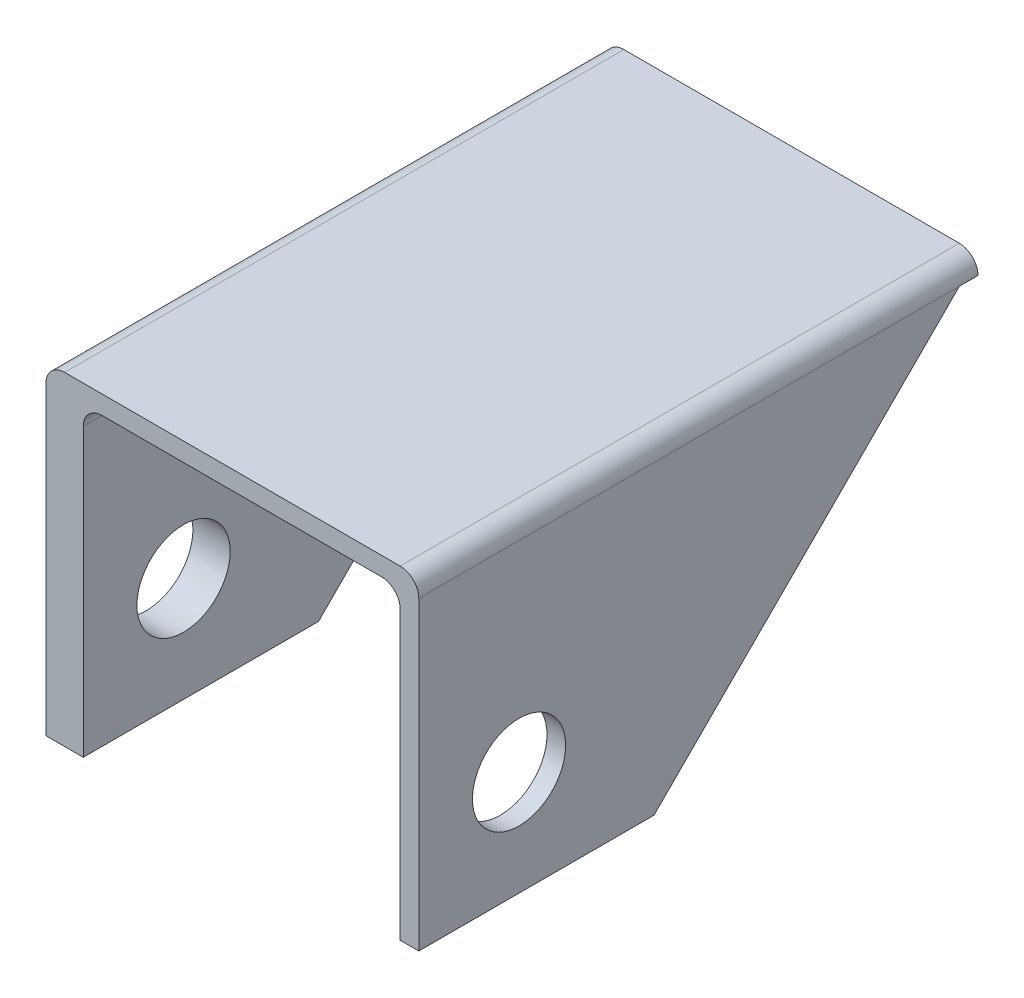
ISO-10303-21;
HEADER;
FILE_DESCRIPTION(('STEP AP214'),'2;1');
FILE_NAME('part.step','',(''),(''),'','','');
FILE_SCHEMA(('AUTOMOTIVE_DESIGN { 1 0 10303 214 1 1 1 1 }'));
ENDSEC;
DATA;
#1=APPLICATION_CONTEXT('core data for automotive mechanical design processes');
#2=APPLICATION_PROTOCOL_DEFINITION('international standard','automotive_design',2000,#1);
#3=PRODUCT_CONTEXT('',#1,'mechanical');
#4=PRODUCT('Part','Part','',(#3));
#5=PRODUCT_RELATED_PRODUCT_CATEGORY('part','',(#4));
#6=PRODUCT_DEFINITION_FORMATION('','',#4);
#7=PRODUCT_DEFINITION_CONTEXT('part definition',#1,'design');
#8=PRODUCT_DEFINITION('design','',#6,#7);
#9=PRODUCT_DEFINITION_SHAPE('','',#8);
#10=(LENGTH_UNIT() NAMED_UNIT(*) SI_UNIT(.MILLI.,.METRE.));
#11=(NAMED_UNIT(*) PLANE_ANGLE_UNIT() SI_UNIT($,.RADIAN.));
#12=(NAMED_UNIT(*) SI_UNIT($,.STERADIAN.) SOLID_ANGLE_UNIT());
#13=UNCERTAINTY_MEASURE_WITH_UNIT(LENGTH_MEASURE(1.E-05),#10,'distance_accuracy_value','');
#14=(GEOMETRIC_REPRESENTATION_CONTEXT(3) GLOBAL_UNCERTAINTY_ASSIGNED_CONTEXT((#13)) GLOBAL_UNIT_ASSIGNED_CONTEXT((#10,
#11,#12)) REPRESENTATION_CONTEXT('',''));
#15=CARTESIAN_POINT('',(0.,0.,0.));
#16=DIRECTION('',(0.,0.,1.));
#17=DIRECTION('',(1.,0.,0.));
#18=AXIS2_PLACEMENT_3D('',#15,#16,#17);
#19=CARTESIAN_POINT('',(1.,24.3409758965315,-30.));
#20=DIRECTION('',(0.,0.707106781186547,0.707106781186547));
#21=DIRECTION('',(0.,-0.707106781186548,0.707106781186548));
#22=AXIS2_PLACEMENT_3D('',#19,#20,#21);
#23=PLANE('',#22);
#24=DIRECTION('',(0.,0.707106781186547,-0.707106781186547));
#25=VECTOR('',#24,1.);
#26=CARTESIAN_POINT('',(2.,24.3409758965315,-30.));
#27=LINE('',#26,#25);
#28=CARTESIAN_POINT('',(2.,6.9567267449838,-12.6157508484523));
#29=VERTEX_POINT('',#28);
#30=CARTESIAN_POINT('',(2.,22.3409758965315,-28.));
#31=VERTEX_POINT('',#30);
#32=EDGE_CURVE('E218',#29,#31,#27,.T.);
#33=ORIENTED_EDGE('',*,*,#32,.F.);
#34=DIRECTION('',(-1.,0.,0.));
#35=VECTOR('',#34,1.);
#36=CARTESIAN_POINT('',(1.,6.9567267449838,-12.6157508484523));
#37=LINE('',#36,#35);
#38=CARTESIAN_POINT('',(0.,6.9567267449838,-12.6157508484523));
#39=VERTEX_POINT('',#38);
#40=EDGE_CURVE('E55',#29,#39,#37,.T.);
#41=ORIENTED_EDGE('',*,*,#40,.T.);
#42=DIRECTION('',(0.,0.707106781186547,-0.707106781186547));
#43=VECTOR('',#42,1.);
#44=CARTESIAN_POINT('',(0.,24.3409758965315,-30.));
#45=LINE('',#44,#43);
#46=CARTESIAN_POINT('',(0.,23.3409758965315,-29.));
#47=VERTEX_POINT('',#46);
#48=EDGE_CURVE('E144',#39,#47,#45,.T.);
#49=ORIENTED_EDGE('',*,*,#48,.T.);
#50=DIRECTION('',(-1.,0.,0.));
#51=VECTOR('',#50,1.);
#52=CARTESIAN_POINT('',(1.,23.3409758965315,-29.));
#53=LINE('',#52,#51);
#54=CARTESIAN_POINT('',(3.,23.3409758965315,-29.));
#55=VERTEX_POINT('',#54);
#56=EDGE_CURVE('E149',#55,#47,#53,.T.);
#57=ORIENTED_EDGE('',*,*,#56,.F.);
#58=CARTESIAN_POINT('',(3.,22.3409758965315,-28.));
#59=DIRECTION('',(0.,0.707106781186547,0.707106781186547));
#60=DIRECTION('',(0.,0.707106781186548,-0.707106781186548));
#61=AXIS2_PLACEMENT_3D('',#58,#59,#60);
#62=ELLIPSE('',#61,1.4142135623731,1.);
#63=EDGE_CURVE('E190',#55,#31,#62,.T.);
#64=ORIENTED_EDGE('',*,*,#63,.T.);
#65=EDGE_LOOP('',(#33,#41,#49,#57,#64));
#66=FACE_BOUND('',#65,.T.);
#67=ADVANCED_FACE('F33',(#66),#23,.F.);
#68=CARTESIAN_POINT('',(1.,-5.65902410346854,0.));
#69=DIRECTION('',(0.,0.,-1.));
#70=DIRECTION('',(-1.,0.,0.));
#71=AXIS2_PLACEMENT_3D('',#68,#69,#70);
#72=PLANE('',#71);
#73=DIRECTION('',(0.,-1.,0.));
#74=VECTOR('',#73,1.);
#75=CARTESIAN_POINT('',(0.,-5.65902410346854,0.));
#76=LINE('',#75,#74);
#77=CARTESIAN_POINT('',(0.,23.3409758965315,0.));
#78=VERTEX_POINT('',#77);
#79=CARTESIAN_POINT('',(0.,6.9567267449838,0.));
#80=VERTEX_POINT('',#79);
#81=EDGE_CURVE('E142',#78,#80,#76,.T.);
#82=ORIENTED_EDGE('',*,*,#81,.T.);
#83=DIRECTION('',(1.,0.,0.));
#84=VECTOR('',#83,1.);
#85=CARTESIAN_POINT('',(1.,6.9567267449838,0.));
#86=LINE('',#85,#84);
#87=CARTESIAN_POINT('',(2.,6.9567267449838,0.));
#88=VERTEX_POINT('',#87);
#89=EDGE_CURVE('E125',#80,#88,#86,.T.);
#90=ORIENTED_EDGE('',*,*,#89,.T.);
#91=DIRECTION('',(0.,-1.,0.));
#92=VECTOR('',#91,1.);
#93=CARTESIAN_POINT('',(2.,-5.65902410346854,0.));
#94=LINE('',#93,#92);
#95=CARTESIAN_POINT('',(2.,22.3409758965315,0.));
#96=VERTEX_POINT('',#95);
#97=EDGE_CURVE('E205',#96,#88,#94,.T.);
#98=ORIENTED_EDGE('',*,*,#97,.F.);
#99=CARTESIAN_POINT('',(3.,22.3409758965315,0.));
#100=DIRECTION('',(0.,0.,-1.));
#101=DIRECTION('',(-1.,0.,0.));
#102=AXIS2_PLACEMENT_3D('',#99,#100,#101);
#103=CIRCLE('',#102,1.);
#104=CARTESIAN_POINT('',(3.,23.3409758965315,0.));
#105=VERTEX_POINT('',#104);
#106=EDGE_CURVE('E193',#96,#105,#103,.T.);
#107=ORIENTED_EDGE('',*,*,#106,.T.);
#108=DIRECTION('',(1.,0.,0.));
#109=VECTOR('',#108,1.);
#110=CARTESIAN_POINT('',(0.,23.3409758965315,0.));
#111=LINE('',#110,#109);
#112=CARTESIAN_POINT('',(18.,23.3409758965315,0.));
#113=VERTEX_POINT('',#112);
#114=EDGE_CURVE('E232',#105,#113,#111,.T.);
#115=ORIENTED_EDGE('',*,*,#114,.T.);
#116=CARTESIAN_POINT('',(18.,22.3409758965315,0.));
#117=DIRECTION('',(0.,0.,-1.));
#118=DIRECTION('',(-1.,0.,0.));
#119=AXIS2_PLACEMENT_3D('',#116,#117,#118);
#120=CIRCLE('',#119,1.);
#121=CARTESIAN_POINT('',(19.,22.3409758965315,0.));
#122=VERTEX_POINT('',#121);
#123=EDGE_CURVE('E41',#113,#122,#120,.T.);
#124=ORIENTED_EDGE('',*,*,#123,.T.);
#125=DIRECTION('',(0.,-1.,0.));
#126=VECTOR('',#125,1.);
#127=CARTESIAN_POINT('',(19.,-5.65902410346854,0.));
#128=LINE('',#127,#126);
#129=CARTESIAN_POINT('',(19.,6.9567267449838,0.));
#130=VERTEX_POINT('',#129);
#131=EDGE_CURVE('E221',#122,#130,#128,.T.);
#132=ORIENTED_EDGE('',*,*,#131,.T.);
#133=CARTESIAN_POINT('',(20.,6.9567267449838,0.));
#134=VERTEX_POINT('',#133);
#135=EDGE_CURVE('E135',#130,#134,#86,.T.);
#136=ORIENTED_EDGE('',*,*,#135,.T.);
#137=DIRECTION('',(0.,1.,0.));
#138=VECTOR('',#137,1.);
#139=CARTESIAN_POINT('',(20.,23.3409758965315,0.));
#140=LINE('',#139,#138);
#141=CARTESIAN_POINT('',(20.,23.3409758965315,0.));
#142=VERTEX_POINT('',#141);
#143=EDGE_CURVE('E154',#134,#142,#140,.T.);
#144=ORIENTED_EDGE('',*,*,#143,.T.);
#145=CARTESIAN_POINT('',(19.,23.3409758965315,0.));
#146=DIRECTION('',(0.,0.,-1.));
#147=DIRECTION('',(-1.,0.,0.));
#148=AXIS2_PLACEMENT_3D('',#145,#146,#147);
#149=CIRCLE('',#148,1.);
#150=CARTESIAN_POINT('',(19.,24.3409758965315,0.));
#151=VERTEX_POINT('',#150);
#152=EDGE_CURVE('E175',#142,#151,#149,.F.);
#153=ORIENTED_EDGE('',*,*,#152,.T.);
#154=DIRECTION('',(-1.,0.,0.));
#155=VECTOR('',#154,1.);
#156=CARTESIAN_POINT('',(1.,24.3409758965315,0.));
#157=LINE('',#156,#155);
#158=CARTESIAN_POINT('',(1.,24.3409758965315,0.));
#159=VERTEX_POINT('',#158);
#160=EDGE_CURVE('E151',#151,#159,#157,.T.);
#161=ORIENTED_EDGE('',*,*,#160,.T.);
#162=CARTESIAN_POINT('',(1.,23.3409758965315,0.));
#163=DIRECTION('',(0.,0.,-1.));
#164=DIRECTION('',(-1.,0.,0.));
#165=AXIS2_PLACEMENT_3D('',#162,#163,#164);
#166=CIRCLE('',#165,1.);
#167=EDGE_CURVE('E148',#159,#78,#166,.F.);
#168=ORIENTED_EDGE('',*,*,#167,.T.);
#169=EDGE_LOOP('',(#82,#90,#98,#107,#115,#124,#132,#136,#144,#153,#161,#168));
#170=FACE_BOUND('',#169,.T.);
#171=ADVANCED_FACE('F146',(#170),#72,.F.);
#172=CARTESIAN_POINT('',(1.,24.3409758965315,0.));
#173=DIRECTION('',(0.,-1.,0.));
#174=DIRECTION('',(0.,0.,-1.));
#175=AXIS2_PLACEMENT_3D('',#172,#173,#174);
#176=PLANE('',#175);
#177=DIRECTION('',(-1.,0.,0.));
#178=VECTOR('',#177,1.);
#179=CARTESIAN_POINT('',(1.,24.3409758965315,-30.));
#180=LINE('',#179,#178);
#181=CARTESIAN_POINT('',(19.,24.3409758965315,-30.));
#182=VERTEX_POINT('',#181);
#183=CARTESIAN_POINT('',(1.,24.3409758965315,-30.));
#184=VERTEX_POINT('',#183);
#185=EDGE_CURVE('E159',#182,#184,#180,.T.);
#186=ORIENTED_EDGE('',*,*,#185,.T.);
#187=DIRECTION('',(0.,0.,1.));
#188=VECTOR('',#187,1.);
#189=CARTESIAN_POINT('',(1.,24.3409758965315,0.));
#190=LINE('',#189,#188);
#191=EDGE_CURVE('E172',#184,#159,#190,.T.);
#192=ORIENTED_EDGE('',*,*,#191,.T.);
#193=ORIENTED_EDGE('',*,*,#160,.F.);
#194=DIRECTION('',(0.,0.,-1.));
#195=VECTOR('',#194,1.);
#196=CARTESIAN_POINT('',(19.,24.3409758965315,-30.));
#197=LINE('',#196,#195);
#198=EDGE_CURVE('E169',#151,#182,#197,.T.);
#199=ORIENTED_EDGE('',*,*,#198,.T.);
#200=EDGE_LOOP('',(#186,#192,#193,#199));
#201=FACE_BOUND('',#200,.T.);
#202=ADVANCED_FACE('F254',(#201),#176,.F.);
#203=CARTESIAN_POINT('',(0.,0.,0.));
#204=DIRECTION('',(-1.,0.,0.));
#205=DIRECTION('',(0.,0.,1.));
#206=AXIS2_PLACEMENT_3D('',#203,#204,#205);
#207=PLANE('',#206);
#208=DIRECTION('',(0.,0.,-1.));
#209=VECTOR('',#208,1.);
#210=CARTESIAN_POINT('',(0.,6.9567267449838,6.4128425443619));
#211=LINE('',#210,#209);
#212=EDGE_CURVE('E128',#80,#39,#211,.T.);
#213=ORIENTED_EDGE('',*,*,#212,.F.);
#214=ORIENTED_EDGE('',*,*,#81,.F.);
#215=DIRECTION('',(0.,0.,1.));
#216=VECTOR('',#215,1.);
#217=CARTESIAN_POINT('',(0.,23.3409758965315,-30.));
#218=LINE('',#217,#216);
#219=EDGE_CURVE('E178',#78,#47,#218,.F.);
#220=ORIENTED_EDGE('',*,*,#219,.T.);
#221=ORIENTED_EDGE('',*,*,#48,.F.);
#222=EDGE_LOOP('',(#213,#214,#220,#221));
#223=FACE_BOUND('',#222,.T.);
#224=CARTESIAN_POINT('',(0.,12.5788203423205,-5.37794980513693));
#225=DIRECTION('',(-1.,0.,0.));
#226=DIRECTION('',(0.,0.,1.));
#227=AXIS2_PLACEMENT_3D('',#224,#225,#226);
#228=CIRCLE('',#227,2.5);
#229=CARTESIAN_POINT('',(0.,12.5788203423205,-2.87794980513692));
#230=VERTEX_POINT('',#229);
#231=EDGE_CURVE('E208',#230,#230,#228,.T.);
#232=ORIENTED_EDGE('',*,*,#231,.F.);
#233=EDGE_LOOP('',(#232));
#234=FACE_BOUND('',#233,.T.);
#235=ADVANCED_FACE('F139',(#223,#234),#207,.T.);
#236=CARTESIAN_POINT('',(0.,23.3409758965315,0.));
#237=DIRECTION('',(0.,1.,0.));
#238=DIRECTION('',(0.,0.,1.));
#239=AXIS2_PLACEMENT_3D('',#236,#237,#238);
#240=PLANE('',#239);
#241=ORIENTED_EDGE('',*,*,#114,.F.);
#242=DIRECTION('',(0.,0.,-1.));
#243=VECTOR('',#242,1.);
#244=CARTESIAN_POINT('',(3.,23.3409758965315,0.));
#245=LINE('',#244,#243);
#246=EDGE_CURVE('E164',#105,#55,#245,.T.);
#247=ORIENTED_EDGE('',*,*,#246,.T.);
#248=ORIENTED_EDGE('',*,*,#56,.T.);
#249=DIRECTION('',(0.,0.,1.));
#250=VECTOR('',#249,1.);
#251=CARTESIAN_POINT('',(0.,23.3409758965315,-30.));
#252=LINE('',#251,#250);
#253=CARTESIAN_POINT('',(0.,23.3409758965315,-30.));
#254=VERTEX_POINT('',#253);
#255=EDGE_CURVE('E229',#254,#47,#252,.T.);
#256=ORIENTED_EDGE('',*,*,#255,.F.);
#257=DIRECTION('',(-1.,0.,0.));
#258=VECTOR('',#257,1.);
#259=CARTESIAN_POINT('',(0.,23.3409758965315,-30.));
#260=LINE('',#259,#258);
#261=CARTESIAN_POINT('',(20.,23.3409758965315,-30.));
#262=VERTEX_POINT('',#261);
#263=EDGE_CURVE('E238',#262,#254,#260,.T.);
#264=ORIENTED_EDGE('',*,*,#263,.F.);
#265=DIRECTION('',(0.,0.,-1.));
#266=VECTOR('',#265,1.);
#267=CARTESIAN_POINT('',(20.,23.3409758965315,-30.));
#268=LINE('',#267,#266);
#269=CARTESIAN_POINT('',(20.,23.3409758965315,-29.));
#270=VERTEX_POINT('',#269);
#271=EDGE_CURVE('E235',#270,#262,#268,.T.);
#272=ORIENTED_EDGE('',*,*,#271,.F.);
#273=DIRECTION('',(-1.,0.,0.));
#274=VECTOR('',#273,1.);
#275=CARTESIAN_POINT('',(0.,23.3409758965315,-29.));
#276=LINE('',#275,#274);
#277=CARTESIAN_POINT('',(18.,23.3409758965315,-29.));
#278=VERTEX_POINT('',#277);
#279=EDGE_CURVE('E226',#270,#278,#276,.T.);
#280=ORIENTED_EDGE('',*,*,#279,.T.);
#281=DIRECTION('',(0.,0.,-1.));
#282=VECTOR('',#281,1.);
#283=CARTESIAN_POINT('',(18.,23.3409758965315,0.));
#284=LINE('',#283,#282);
#285=EDGE_CURVE('E162',#278,#113,#284,.F.);
#286=ORIENTED_EDGE('',*,*,#285,.T.);
#287=EDGE_LOOP('',(#241,#247,#248,#256,#264,#272,#280,#286));
#288=FACE_BOUND('',#287,.T.);
#289=ADVANCED_FACE('F264',(#288),#240,.F.);
#290=CARTESIAN_POINT('',(0.,23.3409758965315,-30.));
#291=DIRECTION('',(0.,0.,-1.));
#292=DIRECTION('',(0.,1.,0.));
#293=AXIS2_PLACEMENT_3D('',#290,#291,#292);
#294=PLANE('',#293);
#295=ORIENTED_EDGE('',*,*,#263,.T.);
#296=CARTESIAN_POINT('',(1.,23.3409758965315,-30.));
#297=DIRECTION('',(0.,0.,-1.));
#298=DIRECTION('',(0.,1.,0.));
#299=AXIS2_PLACEMENT_3D('',#296,#297,#298);
#300=CIRCLE('',#299,1.);
#301=EDGE_CURVE('E182',#254,#184,#300,.T.);
#302=ORIENTED_EDGE('',*,*,#301,.T.);
#303=ORIENTED_EDGE('',*,*,#185,.F.);
#304=CARTESIAN_POINT('',(19.,23.3409758965315,-30.));
#305=DIRECTION('',(0.,0.,-1.));
#306=DIRECTION('',(0.,1.,0.));
#307=AXIS2_PLACEMENT_3D('',#304,#305,#306);
#308=CIRCLE('',#307,1.);
#309=EDGE_CURVE('E180',#182,#262,#308,.T.);
#310=ORIENTED_EDGE('',*,*,#309,.T.);
#311=EDGE_LOOP('',(#295,#302,#303,#310));
#312=FACE_BOUND('',#311,.T.);
#313=ADVANCED_FACE('F257',(#312),#294,.T.);
#314=CARTESIAN_POINT('',(20.,23.3409758965315,-30.));
#315=DIRECTION('',(1.,0.,0.));
#316=DIRECTION('',(0.,0.,-1.));
#317=AXIS2_PLACEMENT_3D('',#314,#315,#316);
#318=PLANE('',#317);
#319=DIRECTION('',(0.,0.,-1.));
#320=VECTOR('',#319,1.);
#321=CARTESIAN_POINT('',(20.,6.9567267449838,6.4128425443619));
#322=LINE('',#321,#320);
#323=CARTESIAN_POINT('',(20.,6.95672674498379,-12.6157508484523));
#324=VERTEX_POINT('',#323);
#325=EDGE_CURVE('E133',#134,#324,#322,.T.);
#326=ORIENTED_EDGE('',*,*,#325,.T.);
#327=DIRECTION('',(0.,0.707106781186547,-0.707106781186547));
#328=VECTOR('',#327,1.);
#329=CARTESIAN_POINT('',(20.,24.3409758965315,-30.));
#330=LINE('',#329,#328);
#331=EDGE_CURVE('E220',#324,#270,#330,.T.);
#332=ORIENTED_EDGE('',*,*,#331,.T.);
#333=DIRECTION('',(0.,0.,-1.));
#334=VECTOR('',#333,1.);
#335=CARTESIAN_POINT('',(20.,23.3409758965315,0.));
#336=LINE('',#335,#334);
#337=EDGE_CURVE('E187',#270,#142,#336,.F.);
#338=ORIENTED_EDGE('',*,*,#337,.T.);
#339=ORIENTED_EDGE('',*,*,#143,.F.);
#340=EDGE_LOOP('',(#326,#332,#338,#339));
#341=FACE_BOUND('',#340,.T.);
#342=CARTESIAN_POINT('',(20.,12.5788203423205,-5.37794980513693));
#343=DIRECTION('',(-1.,0.,0.));
#344=DIRECTION('',(0.,0.,1.));
#345=AXIS2_PLACEMENT_3D('',#342,#343,#344);
#346=CIRCLE('',#345,2.5);
#347=CARTESIAN_POINT('',(20.,12.5788203423205,-2.87794980513692));
#348=VERTEX_POINT('',#347);
#349=EDGE_CURVE('E201',#348,#348,#346,.T.);
#350=ORIENTED_EDGE('',*,*,#349,.T.);
#351=EDGE_LOOP('',(#350));
#352=FACE_BOUND('',#351,.T.);
#353=ADVANCED_FACE('F247',(#341,#352),#318,.T.);
#354=CARTESIAN_POINT('',(19.,0.,0.));
#355=DIRECTION('',(1.,0.,0.));
#356=DIRECTION('',(0.,0.,1.));
#357=AXIS2_PLACEMENT_3D('',#354,#355,#356);
#358=PLANE('',#357);
#359=CARTESIAN_POINT('',(19.,12.5788203423205,-5.37794980513693));
#360=DIRECTION('',(1.,0.,0.));
#361=DIRECTION('',(0.,0.,-1.));
#362=AXIS2_PLACEMENT_3D('',#359,#360,#361);
#363=CIRCLE('',#362,2.5);
#364=CARTESIAN_POINT('',(19.,12.5788203423205,-7.87794980513693));
#365=VERTEX_POINT('',#364);
#366=EDGE_CURVE('E200',#365,#365,#363,.T.);
#367=ORIENTED_EDGE('',*,*,#366,.T.);
#368=EDGE_LOOP('',(#367));
#369=FACE_BOUND('',#368,.T.);
#370=DIRECTION('',(0.,0.707106781186547,-0.707106781186547));
#371=VECTOR('',#370,1.);
#372=CARTESIAN_POINT('',(19.,24.3409758965315,-30.));
#373=LINE('',#372,#371);
#374=CARTESIAN_POINT('',(19.,6.9567267449838,-12.6157508484523));
#375=VERTEX_POINT('',#374);
#376=CARTESIAN_POINT('',(19.,22.3409758965315,-28.));
#377=VERTEX_POINT('',#376);
#378=EDGE_CURVE('E224',#375,#377,#373,.T.);
#379=ORIENTED_EDGE('',*,*,#378,.F.);
#380=DIRECTION('',(0.,0.,1.));
#381=VECTOR('',#380,1.);
#382=CARTESIAN_POINT('',(19.,6.9567267449838,0.));
#383=LINE('',#382,#381);
#384=EDGE_CURVE('E48',#375,#130,#383,.T.);
#385=ORIENTED_EDGE('',*,*,#384,.T.);
#386=ORIENTED_EDGE('',*,*,#131,.F.);
#387=DIRECTION('',(0.,0.,-1.));
#388=VECTOR('',#387,1.);
#389=CARTESIAN_POINT('',(19.,22.3409758965315,-29.));
#390=LINE('',#389,#388);
#391=EDGE_CURVE('E184',#122,#377,#390,.T.);
#392=ORIENTED_EDGE('',*,*,#391,.T.);
#393=EDGE_LOOP('',(#379,#385,#386,#392));
#394=FACE_BOUND('',#393,.T.);
#395=ADVANCED_FACE('F286',(#369,#394),#358,.F.);
#396=CARTESIAN_POINT('',(19.,24.3409758965315,-30.));
#397=DIRECTION('',(0.,-0.707106781186547,-0.707106781186547));
#398=DIRECTION('',(0.,0.707106781186548,-0.707106781186548));
#399=AXIS2_PLACEMENT_3D('',#396,#397,#398);
#400=PLANE('',#399);
#401=DIRECTION('',(1.,0.,0.));
#402=VECTOR('',#401,1.);
#403=CARTESIAN_POINT('',(19.,6.9567267449838,-12.6157508484523));
#404=LINE('',#403,#402);
#405=EDGE_CURVE('E287',#375,#324,#404,.T.);
#406=ORIENTED_EDGE('',*,*,#405,.F.);
#407=ORIENTED_EDGE('',*,*,#378,.T.);
#408=CARTESIAN_POINT('',(18.,22.3409758965315,-28.));
#409=DIRECTION('',(0.,-0.707106781186547,-0.707106781186547));
#410=DIRECTION('',(0.,-0.707106781186548,0.707106781186548));
#411=AXIS2_PLACEMENT_3D('',#408,#409,#410);
#412=ELLIPSE('',#411,1.4142135623731,1.);
#413=EDGE_CURVE('E195',#377,#278,#412,.F.);
#414=ORIENTED_EDGE('',*,*,#413,.T.);
#415=ORIENTED_EDGE('',*,*,#279,.F.);
#416=ORIENTED_EDGE('',*,*,#331,.F.);
#417=EDGE_LOOP('',(#406,#407,#414,#415,#416));
#418=FACE_BOUND('',#417,.T.);
#419=ADVANCED_FACE('F291',(#418),#400,.T.);
#420=CARTESIAN_POINT('',(2.,0.,0.));
#421=DIRECTION('',(1.,0.,0.));
#422=DIRECTION('',(0.,0.,1.));
#423=AXIS2_PLACEMENT_3D('',#420,#421,#422);
#424=PLANE('',#423);
#425=DIRECTION('',(0.,0.,1.));
#426=VECTOR('',#425,1.);
#427=CARTESIAN_POINT('',(2.,6.9567267449838,0.));
#428=LINE('',#427,#426);
#429=EDGE_CURVE('E11',#29,#88,#428,.T.);
#430=ORIENTED_EDGE('',*,*,#429,.F.);
#431=ORIENTED_EDGE('',*,*,#32,.T.);
#432=DIRECTION('',(0.,0.,-1.));
#433=VECTOR('',#432,1.);
#434=CARTESIAN_POINT('',(2.,22.3409758965315,0.));
#435=LINE('',#434,#433);
#436=EDGE_CURVE('E167',#31,#96,#435,.F.);
#437=ORIENTED_EDGE('',*,*,#436,.T.);
#438=ORIENTED_EDGE('',*,*,#97,.T.);
#439=EDGE_LOOP('',(#430,#431,#437,#438));
#440=FACE_BOUND('',#439,.T.);
#441=CARTESIAN_POINT('',(2.,12.5788203423205,-5.37794980513693));
#442=DIRECTION('',(1.,0.,0.));
#443=DIRECTION('',(0.,0.,-1.));
#444=AXIS2_PLACEMENT_3D('',#441,#442,#443);
#445=CIRCLE('',#444,2.5);
#446=CARTESIAN_POINT('',(2.,12.5788203423205,-7.87794980513693));
#447=VERTEX_POINT('',#446);
#448=EDGE_CURVE('E198',#447,#447,#445,.T.);
#449=ORIENTED_EDGE('',*,*,#448,.F.);
#450=EDGE_LOOP('',(#449));
#451=FACE_BOUND('',#450,.T.);
#452=ADVANCED_FACE('F274',(#440,#451),#424,.T.);
#453=CARTESIAN_POINT('',(3.,22.3409758965315,0.));
#454=DIRECTION('',(0.,0.,-1.));
#455=DIRECTION('',(0.,1.,0.));
#456=AXIS2_PLACEMENT_3D('',#453,#454,#455);
#457=CYLINDRICAL_SURFACE('',#456,1.);
#458=ORIENTED_EDGE('',*,*,#106,.F.);
#459=ORIENTED_EDGE('',*,*,#436,.F.);
#460=ORIENTED_EDGE('',*,*,#63,.F.);
#461=ORIENTED_EDGE('',*,*,#246,.F.);
#462=EDGE_LOOP('',(#458,#459,#460,#461));
#463=FACE_BOUND('',#462,.T.);
#464=ADVANCED_FACE('F272',(#463),#457,.F.);
#465=CARTESIAN_POINT('',(1.,23.3409758965315,0.));
#466=DIRECTION('',(0.,0.,-1.));
#467=DIRECTION('',(0.,1.,0.));
#468=AXIS2_PLACEMENT_3D('',#465,#466,#467);
#469=CYLINDRICAL_SURFACE('',#468,1.);
#470=ORIENTED_EDGE('',*,*,#255,.T.);
#471=ORIENTED_EDGE('',*,*,#219,.F.);
#472=ORIENTED_EDGE('',*,*,#167,.F.);
#473=ORIENTED_EDGE('',*,*,#191,.F.);
#474=ORIENTED_EDGE('',*,*,#301,.F.);
#475=EDGE_LOOP('',(#470,#471,#472,#473,#474));
#476=FACE_BOUND('',#475,.T.);
#477=ADVANCED_FACE('F261',(#476),#469,.T.);
#478=CARTESIAN_POINT('',(18.,22.3409758965315,0.));
#479=DIRECTION('',(0.,0.,1.));
#480=DIRECTION('',(1.,0.,0.));
#481=AXIS2_PLACEMENT_3D('',#478,#479,#480);
#482=CYLINDRICAL_SURFACE('',#481,1.);
#483=ORIENTED_EDGE('',*,*,#123,.F.);
#484=ORIENTED_EDGE('',*,*,#285,.F.);
#485=ORIENTED_EDGE('',*,*,#413,.F.);
#486=ORIENTED_EDGE('',*,*,#391,.F.);
#487=EDGE_LOOP('',(#483,#484,#485,#486));
#488=FACE_BOUND('',#487,.T.);
#489=ADVANCED_FACE('F281',(#488),#482,.F.);
#490=CARTESIAN_POINT('',(19.,23.3409758965315,0.));
#491=DIRECTION('',(0.,0.,1.));
#492=DIRECTION('',(0.,-1.,0.));
#493=AXIS2_PLACEMENT_3D('',#490,#491,#492);
#494=CYLINDRICAL_SURFACE('',#493,1.);
#495=ORIENTED_EDGE('',*,*,#337,.F.);
#496=ORIENTED_EDGE('',*,*,#271,.T.);
#497=ORIENTED_EDGE('',*,*,#309,.F.);
#498=ORIENTED_EDGE('',*,*,#198,.F.);
#499=ORIENTED_EDGE('',*,*,#152,.F.);
#500=EDGE_LOOP('',(#495,#496,#497,#498,#499));
#501=FACE_BOUND('',#500,.T.);
#502=ADVANCED_FACE('F35',(#501),#494,.T.);
#503=CARTESIAN_POINT('',(20.,12.5788203423205,-5.37794980513693));
#504=DIRECTION('',(-1.,0.,0.));
#505=DIRECTION('',(0.,0.,1.));
#506=AXIS2_PLACEMENT_3D('',#503,#504,#505);
#507=CYLINDRICAL_SURFACE('',#506,2.5);
#508=ORIENTED_EDGE('',*,*,#448,.T.);
#509=EDGE_LOOP('',(#508));
#510=FACE_BOUND('',#509,.T.);
#511=ORIENTED_EDGE('',*,*,#231,.T.);
#512=EDGE_LOOP('',(#511));
#513=FACE_BOUND('',#512,.T.);
#514=ADVANCED_FACE('F318',(#510,#513),#507,.F.);
#515=ORIENTED_EDGE('',*,*,#349,.F.);
#516=EDGE_LOOP('',(#515));
#517=FACE_BOUND('',#516,.T.);
#518=ORIENTED_EDGE('',*,*,#366,.F.);
#519=EDGE_LOOP('',(#518));
#520=FACE_BOUND('',#519,.T.);
#521=ADVANCED_FACE('F322',(#517,#520),#507,.F.);
#522=CARTESIAN_POINT('',(20.,6.9567267449838,6.4128425443619));
#523=DIRECTION('',(0.,1.,0.));
#524=DIRECTION('',(0.,0.,1.));
#525=AXIS2_PLACEMENT_3D('',#522,#523,#524);
#526=PLANE('',#525);
#527=ORIENTED_EDGE('',*,*,#429,.T.);
#528=ORIENTED_EDGE('',*,*,#89,.F.);
#529=ORIENTED_EDGE('',*,*,#212,.T.);
#530=ORIENTED_EDGE('',*,*,#40,.F.);
#531=EDGE_LOOP('',(#527,#528,#529,#530));
#532=FACE_BOUND('',#531,.T.);
#533=ADVANCED_FACE('F127',(#532),#526,.F.);
#534=ORIENTED_EDGE('',*,*,#384,.F.);
#535=ORIENTED_EDGE('',*,*,#405,.T.);
#536=ORIENTED_EDGE('',*,*,#325,.F.);
#537=ORIENTED_EDGE('',*,*,#135,.F.);
#538=EDGE_LOOP('',(#534,#535,#536,#537));
#539=FACE_BOUND('',#538,.T.);
#540=ADVANCED_FACE('F330',(#539),#526,.F.);
#541=CLOSED_SHELL('',(#67,#171,#202,#235,#289,#313,#353,#395,#419,#452,#464,#477,#489,#502,#514,
#521,#533,#540));
#542=MANIFOLD_SOLID_BREP('B2',#541);
#543=ADVANCED_BREP_SHAPE_REPRESENTATION('',(#18,#542),#14);
#544=SHAPE_DEFINITION_REPRESENTATION(#9,#543);
ENDSEC;
END-ISO-10303-21;
